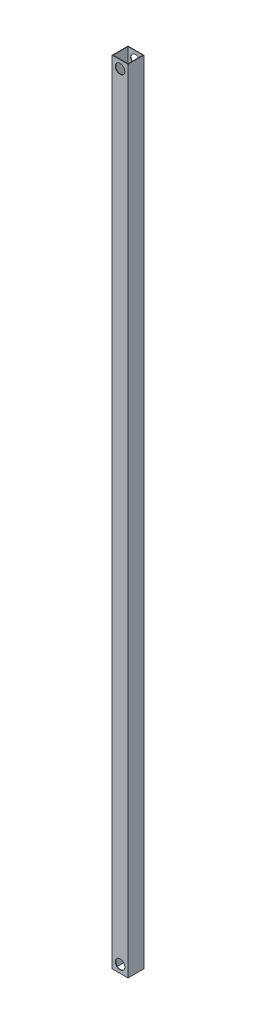
ISO-10303-21;
HEADER;
FILE_DESCRIPTION(('STEP AP214'),'2;1');
FILE_NAME('part.step','',(''),(''),'','','');
FILE_SCHEMA(('AUTOMOTIVE_DESIGN { 1 0 10303 214 1 1 1 1 }'));
ENDSEC;
DATA;
#1=APPLICATION_CONTEXT('core data for automotive mechanical design processes');
#2=APPLICATION_PROTOCOL_DEFINITION('international standard','automotive_design',2000,#1);
#3=PRODUCT_CONTEXT('',#1,'mechanical');
#4=PRODUCT('Part','Part','',(#3));
#5=PRODUCT_RELATED_PRODUCT_CATEGORY('part','',(#4));
#6=PRODUCT_DEFINITION_FORMATION('','',#4);
#7=PRODUCT_DEFINITION_CONTEXT('part definition',#1,'design');
#8=PRODUCT_DEFINITION('design','',#6,#7);
#9=PRODUCT_DEFINITION_SHAPE('','',#8);
#10=(LENGTH_UNIT() NAMED_UNIT(*) SI_UNIT(.MILLI.,.METRE.));
#11=(NAMED_UNIT(*) PLANE_ANGLE_UNIT() SI_UNIT($,.RADIAN.));
#12=(NAMED_UNIT(*) SI_UNIT($,.STERADIAN.) SOLID_ANGLE_UNIT());
#13=UNCERTAINTY_MEASURE_WITH_UNIT(LENGTH_MEASURE(1.E-05),#10,'distance_accuracy_value','');
#14=(GEOMETRIC_REPRESENTATION_CONTEXT(3) GLOBAL_UNCERTAINTY_ASSIGNED_CONTEXT((#13)) GLOBAL_UNIT_ASSIGNED_CONTEXT((#10,
#11,#12)) REPRESENTATION_CONTEXT('',''));
#15=CARTESIAN_POINT('',(0.,0.,0.));
#16=DIRECTION('',(0.,0.,1.));
#17=DIRECTION('',(1.,0.,0.));
#18=AXIS2_PLACEMENT_3D('',#15,#16,#17);
#19=CARTESIAN_POINT('',(5.,500.,-5.));
#20=DIRECTION('',(-1.,0.,0.));
#21=DIRECTION('',(0.,0.,1.));
#22=AXIS2_PLACEMENT_3D('',#19,#20,#21);
#23=PLANE('',#22);
#24=DIRECTION('',(0.,0.,-1.));
#25=VECTOR('',#24,1.);
#26=CARTESIAN_POINT('',(5.,0.,-5.));
#27=LINE('',#26,#25);
#28=CARTESIAN_POINT('',(5.,0.,5.));
#29=VERTEX_POINT('',#28);
#30=CARTESIAN_POINT('',(5.,0.,-5.));
#31=VERTEX_POINT('',#30);
#32=EDGE_CURVE('E152',#29,#31,#27,.T.);
#33=ORIENTED_EDGE('',*,*,#32,.T.);
#34=DIRECTION('',(0.,-1.,0.));
#35=VECTOR('',#34,1.);
#36=CARTESIAN_POINT('',(5.,500.,-5.));
#37=LINE('',#36,#35);
#38=CARTESIAN_POINT('',(5.,500.,-5.));
#39=VERTEX_POINT('',#38);
#40=EDGE_CURVE('E11',#39,#31,#37,.T.);
#41=ORIENTED_EDGE('',*,*,#40,.F.);
#42=DIRECTION('',(0.,0.,-1.));
#43=VECTOR('',#42,1.);
#44=CARTESIAN_POINT('',(5.,500.,-5.));
#45=LINE('',#44,#43);
#46=CARTESIAN_POINT('',(5.,500.,5.));
#47=VERTEX_POINT('',#46);
#48=EDGE_CURVE('E158',#47,#39,#45,.T.);
#49=ORIENTED_EDGE('',*,*,#48,.F.);
#50=DIRECTION('',(0.,-1.,0.));
#51=VECTOR('',#50,1.);
#52=CARTESIAN_POINT('',(5.,500.,5.));
#53=LINE('',#52,#51);
#54=EDGE_CURVE('E172',#47,#29,#53,.T.);
#55=ORIENTED_EDGE('',*,*,#54,.T.);
#56=EDGE_LOOP('',(#33,#41,#49,#55));
#57=FACE_BOUND('',#56,.T.);
#58=ADVANCED_FACE('F39',(#57),#23,.F.);
#59=CARTESIAN_POINT('',(-5.,500.,-5.));
#60=DIRECTION('',(0.,0.,1.));
#61=DIRECTION('',(1.,0.,0.));
#62=AXIS2_PLACEMENT_3D('',#59,#60,#61);
#63=PLANE('',#62);
#64=CARTESIAN_POINT('',(0.,495.,-5.));
#65=DIRECTION('',(0.,0.,1.));
#66=DIRECTION('',(1.,0.,0.));
#67=AXIS2_PLACEMENT_3D('',#64,#65,#66);
#68=CIRCLE('',#67,3.);
#69=CARTESIAN_POINT('',(2.99999999999998,495.,-5.));
#70=VERTEX_POINT('',#69);
#71=EDGE_CURVE('E204',#70,#70,#68,.T.);
#72=ORIENTED_EDGE('',*,*,#71,.T.);
#73=EDGE_LOOP('',(#72));
#74=FACE_BOUND('',#73,.T.);
#75=CARTESIAN_POINT('',(0.,5.,-5.));
#76=DIRECTION('',(0.,0.,1.));
#77=DIRECTION('',(1.,0.,0.));
#78=AXIS2_PLACEMENT_3D('',#75,#76,#77);
#79=CIRCLE('',#78,3.);
#80=CARTESIAN_POINT('',(3.,5.,-5.));
#81=VERTEX_POINT('',#80);
#82=EDGE_CURVE('E134',#81,#81,#79,.T.);
#83=ORIENTED_EDGE('',*,*,#82,.T.);
#84=EDGE_LOOP('',(#83));
#85=FACE_BOUND('',#84,.T.);
#86=DIRECTION('',(-1.,0.,0.));
#87=VECTOR('',#86,1.);
#88=CARTESIAN_POINT('',(-5.,0.,-5.));
#89=LINE('',#88,#87);
#90=CARTESIAN_POINT('',(-5.,0.,-5.));
#91=VERTEX_POINT('',#90);
#92=EDGE_CURVE('E176',#31,#91,#89,.T.);
#93=ORIENTED_EDGE('',*,*,#92,.T.);
#94=DIRECTION('',(0.,-1.,0.));
#95=VECTOR('',#94,1.);
#96=CARTESIAN_POINT('',(-5.,500.,-5.));
#97=LINE('',#96,#95);
#98=CARTESIAN_POINT('',(-5.,500.,-5.));
#99=VERTEX_POINT('',#98);
#100=EDGE_CURVE('E48',#99,#91,#97,.T.);
#101=ORIENTED_EDGE('',*,*,#100,.F.);
#102=DIRECTION('',(-1.,0.,0.));
#103=VECTOR('',#102,1.);
#104=CARTESIAN_POINT('',(-5.,500.,-5.));
#105=LINE('',#104,#103);
#106=EDGE_CURVE('E162',#39,#99,#105,.T.);
#107=ORIENTED_EDGE('',*,*,#106,.F.);
#108=ORIENTED_EDGE('',*,*,#40,.T.);
#109=EDGE_LOOP('',(#93,#101,#107,#108));
#110=FACE_BOUND('',#109,.T.);
#111=ADVANCED_FACE('F234',(#74,#85,#110),#63,.F.);
#112=CARTESIAN_POINT('',(-5.,500.,-5.));
#113=DIRECTION('',(1.,0.,0.));
#114=DIRECTION('',(0.,0.,-1.));
#115=AXIS2_PLACEMENT_3D('',#112,#113,#114);
#116=PLANE('',#115);
#117=DIRECTION('',(0.,0.,1.));
#118=VECTOR('',#117,1.);
#119=CARTESIAN_POINT('',(-5.,0.,-5.));
#120=LINE('',#119,#118);
#121=CARTESIAN_POINT('',(-5.,0.,5.));
#122=VERTEX_POINT('',#121);
#123=EDGE_CURVE('E179',#91,#122,#120,.T.);
#124=ORIENTED_EDGE('',*,*,#123,.T.);
#125=DIRECTION('',(0.,-1.,0.));
#126=VECTOR('',#125,1.);
#127=CARTESIAN_POINT('',(-5.,500.,5.));
#128=LINE('',#127,#126);
#129=CARTESIAN_POINT('',(-5.,500.,5.));
#130=VERTEX_POINT('',#129);
#131=EDGE_CURVE('E187',#130,#122,#128,.T.);
#132=ORIENTED_EDGE('',*,*,#131,.F.);
#133=DIRECTION('',(0.,0.,1.));
#134=VECTOR('',#133,1.);
#135=CARTESIAN_POINT('',(-5.,500.,-5.));
#136=LINE('',#135,#134);
#137=EDGE_CURVE('E166',#99,#130,#136,.T.);
#138=ORIENTED_EDGE('',*,*,#137,.F.);
#139=ORIENTED_EDGE('',*,*,#100,.T.);
#140=EDGE_LOOP('',(#124,#132,#138,#139));
#141=FACE_BOUND('',#140,.T.);
#142=ADVANCED_FACE('F237',(#141),#116,.F.);
#143=CARTESIAN_POINT('',(-5.,500.,5.));
#144=DIRECTION('',(0.,0.,-1.));
#145=DIRECTION('',(-1.,0.,0.));
#146=AXIS2_PLACEMENT_3D('',#143,#144,#145);
#147=PLANE('',#146);
#148=CARTESIAN_POINT('',(0.,495.,5.));
#149=DIRECTION('',(0.,0.,1.));
#150=DIRECTION('',(1.,0.,0.));
#151=AXIS2_PLACEMENT_3D('',#148,#149,#150);
#152=CIRCLE('',#151,3.);
#153=CARTESIAN_POINT('',(2.99999999999998,495.,5.));
#154=VERTEX_POINT('',#153);
#155=EDGE_CURVE('E216',#154,#154,#152,.T.);
#156=ORIENTED_EDGE('',*,*,#155,.F.);
#157=EDGE_LOOP('',(#156));
#158=FACE_BOUND('',#157,.T.);
#159=CARTESIAN_POINT('',(0.,5.,5.));
#160=DIRECTION('',(0.,0.,1.));
#161=DIRECTION('',(1.,0.,0.));
#162=AXIS2_PLACEMENT_3D('',#159,#160,#161);
#163=CIRCLE('',#162,3.);
#164=CARTESIAN_POINT('',(3.,5.,5.));
#165=VERTEX_POINT('',#164);
#166=EDGE_CURVE('E197',#165,#165,#163,.T.);
#167=ORIENTED_EDGE('',*,*,#166,.F.);
#168=EDGE_LOOP('',(#167));
#169=FACE_BOUND('',#168,.T.);
#170=DIRECTION('',(1.,0.,0.));
#171=VECTOR('',#170,1.);
#172=CARTESIAN_POINT('',(-5.,0.,5.));
#173=LINE('',#172,#171);
#174=EDGE_CURVE('E163',#122,#29,#173,.T.);
#175=ORIENTED_EDGE('',*,*,#174,.T.);
#176=ORIENTED_EDGE('',*,*,#54,.F.);
#177=DIRECTION('',(1.,0.,0.));
#178=VECTOR('',#177,1.);
#179=CARTESIAN_POINT('',(-5.,500.,5.));
#180=LINE('',#179,#178);
#181=EDGE_CURVE('E169',#130,#47,#180,.T.);
#182=ORIENTED_EDGE('',*,*,#181,.F.);
#183=ORIENTED_EDGE('',*,*,#131,.T.);
#184=EDGE_LOOP('',(#175,#176,#182,#183));
#185=FACE_BOUND('',#184,.T.);
#186=ADVANCED_FACE('F251',(#158,#169,#185),#147,.F.);
#187=CARTESIAN_POINT('',(0.,500.,0.));
#188=DIRECTION('',(0.,1.,0.));
#189=DIRECTION('',(0.,0.,1.));
#190=AXIS2_PLACEMENT_3D('',#187,#188,#189);
#191=PLANE('',#190);
#192=DIRECTION('',(0.,0.,-1.));
#193=VECTOR('',#192,1.);
#194=CARTESIAN_POINT('',(4.683,500.,-4.683));
#195=LINE('',#194,#193);
#196=CARTESIAN_POINT('',(4.683,500.,4.683));
#197=VERTEX_POINT('',#196);
#198=CARTESIAN_POINT('',(4.683,500.,-4.683));
#199=VERTEX_POINT('',#198);
#200=EDGE_CURVE('E56',#197,#199,#195,.T.);
#201=ORIENTED_EDGE('',*,*,#200,.F.);
#202=DIRECTION('',(1.,0.,0.));
#203=VECTOR('',#202,1.);
#204=CARTESIAN_POINT('',(-4.683,500.,4.683));
#205=LINE('',#204,#203);
#206=CARTESIAN_POINT('',(-4.683,500.,4.683));
#207=VERTEX_POINT('',#206);
#208=EDGE_CURVE('E127',#207,#197,#205,.T.);
#209=ORIENTED_EDGE('',*,*,#208,.F.);
#210=DIRECTION('',(0.,0.,1.));
#211=VECTOR('',#210,1.);
#212=CARTESIAN_POINT('',(-4.683,500.,-4.683));
#213=LINE('',#212,#211);
#214=CARTESIAN_POINT('',(-4.683,500.,-4.683));
#215=VERTEX_POINT('',#214);
#216=EDGE_CURVE('E131',#215,#207,#213,.T.);
#217=ORIENTED_EDGE('',*,*,#216,.F.);
#218=DIRECTION('',(-1.,0.,0.));
#219=VECTOR('',#218,1.);
#220=CARTESIAN_POINT('',(-4.683,500.,-4.683));
#221=LINE('',#220,#219);
#222=EDGE_CURVE('E143',#199,#215,#221,.T.);
#223=ORIENTED_EDGE('',*,*,#222,.F.);
#224=EDGE_LOOP('',(#201,#209,#217,#223));
#225=FACE_BOUND('',#224,.T.);
#226=ORIENTED_EDGE('',*,*,#48,.T.);
#227=ORIENTED_EDGE('',*,*,#106,.T.);
#228=ORIENTED_EDGE('',*,*,#137,.T.);
#229=ORIENTED_EDGE('',*,*,#181,.T.);
#230=EDGE_LOOP('',(#226,#227,#228,#229));
#231=FACE_BOUND('',#230,.T.);
#232=ADVANCED_FACE('F256',(#225,#231),#191,.T.);
#233=CARTESIAN_POINT('',(0.,0.,0.));
#234=DIRECTION('',(0.,1.,0.));
#235=DIRECTION('',(0.,0.,1.));
#236=AXIS2_PLACEMENT_3D('',#233,#234,#235);
#237=PLANE('',#236);
#238=DIRECTION('',(1.,0.,0.));
#239=VECTOR('',#238,1.);
#240=CARTESIAN_POINT('',(-4.683,0.,4.683));
#241=LINE('',#240,#239);
#242=CARTESIAN_POINT('',(-4.683,0.,4.683));
#243=VERTEX_POINT('',#242);
#244=CARTESIAN_POINT('',(4.683,0.,4.683));
#245=VERTEX_POINT('',#244);
#246=EDGE_CURVE('E115',#243,#245,#241,.T.);
#247=ORIENTED_EDGE('',*,*,#246,.T.);
#248=DIRECTION('',(0.,0.,-1.));
#249=VECTOR('',#248,1.);
#250=CARTESIAN_POINT('',(4.683,0.,-4.683));
#251=LINE('',#250,#249);
#252=CARTESIAN_POINT('',(4.683,0.,-4.683));
#253=VERTEX_POINT('',#252);
#254=EDGE_CURVE('E108',#245,#253,#251,.T.);
#255=ORIENTED_EDGE('',*,*,#254,.T.);
#256=DIRECTION('',(-1.,0.,0.));
#257=VECTOR('',#256,1.);
#258=CARTESIAN_POINT('',(-4.683,0.,-4.683));
#259=LINE('',#258,#257);
#260=CARTESIAN_POINT('',(-4.683,0.,-4.683));
#261=VERTEX_POINT('',#260);
#262=EDGE_CURVE('E118',#253,#261,#259,.T.);
#263=ORIENTED_EDGE('',*,*,#262,.T.);
#264=DIRECTION('',(0.,0.,1.));
#265=VECTOR('',#264,1.);
#266=CARTESIAN_POINT('',(-4.683,0.,-4.683));
#267=LINE('',#266,#265);
#268=EDGE_CURVE('E64',#261,#243,#267,.T.);
#269=ORIENTED_EDGE('',*,*,#268,.T.);
#270=EDGE_LOOP('',(#247,#255,#263,#269));
#271=FACE_BOUND('',#270,.T.);
#272=ORIENTED_EDGE('',*,*,#32,.F.);
#273=ORIENTED_EDGE('',*,*,#174,.F.);
#274=ORIENTED_EDGE('',*,*,#123,.F.);
#275=ORIENTED_EDGE('',*,*,#92,.F.);
#276=EDGE_LOOP('',(#272,#273,#274,#275));
#277=FACE_BOUND('',#276,.T.);
#278=ADVANCED_FACE('F123',(#271,#277),#237,.F.);
#279=CARTESIAN_POINT('',(4.683,0.,-4.683));
#280=DIRECTION('',(1.,0.,0.));
#281=DIRECTION('',(0.,0.,-1.));
#282=AXIS2_PLACEMENT_3D('',#279,#280,#281);
#283=PLANE('',#282);
#284=ORIENTED_EDGE('',*,*,#200,.T.);
#285=DIRECTION('',(0.,1.,0.));
#286=VECTOR('',#285,1.);
#287=CARTESIAN_POINT('',(4.683,0.,-4.683));
#288=LINE('',#287,#286);
#289=EDGE_CURVE('E104',#253,#199,#288,.T.);
#290=ORIENTED_EDGE('',*,*,#289,.F.);
#291=ORIENTED_EDGE('',*,*,#254,.F.);
#292=DIRECTION('',(0.,1.,0.));
#293=VECTOR('',#292,1.);
#294=CARTESIAN_POINT('',(4.683,0.,4.683));
#295=LINE('',#294,#293);
#296=EDGE_CURVE('E149',#245,#197,#295,.T.);
#297=ORIENTED_EDGE('',*,*,#296,.T.);
#298=EDGE_LOOP('',(#284,#290,#291,#297));
#299=FACE_BOUND('',#298,.T.);
#300=ADVANCED_FACE('F106',(#299),#283,.F.);
#301=CARTESIAN_POINT('',(-4.683,0.,4.683));
#302=DIRECTION('',(0.,0.,1.));
#303=DIRECTION('',(1.,0.,0.));
#304=AXIS2_PLACEMENT_3D('',#301,#302,#303);
#305=PLANE('',#304);
#306=CARTESIAN_POINT('',(0.,495.,4.68299999999999));
#307=DIRECTION('',(0.,0.,1.));
#308=DIRECTION('',(1.,0.,0.));
#309=AXIS2_PLACEMENT_3D('',#306,#307,#308);
#310=CIRCLE('',#309,3.);
#311=CARTESIAN_POINT('',(2.99999999999998,495.,4.68299999999999));
#312=VERTEX_POINT('',#311);
#313=EDGE_CURVE('E210',#312,#312,#310,.T.);
#314=ORIENTED_EDGE('',*,*,#313,.T.);
#315=EDGE_LOOP('',(#314));
#316=FACE_BOUND('',#315,.T.);
#317=CARTESIAN_POINT('',(0.,5.,4.68299999999999));
#318=DIRECTION('',(0.,0.,1.));
#319=DIRECTION('',(1.,0.,0.));
#320=AXIS2_PLACEMENT_3D('',#317,#318,#319);
#321=CIRCLE('',#320,3.);
#322=CARTESIAN_POINT('',(3.,5.,4.68299999999999));
#323=VERTEX_POINT('',#322);
#324=EDGE_CURVE('E196',#323,#323,#321,.T.);
#325=ORIENTED_EDGE('',*,*,#324,.T.);
#326=EDGE_LOOP('',(#325));
#327=FACE_BOUND('',#326,.T.);
#328=ORIENTED_EDGE('',*,*,#208,.T.);
#329=ORIENTED_EDGE('',*,*,#296,.F.);
#330=ORIENTED_EDGE('',*,*,#246,.F.);
#331=DIRECTION('',(0.,1.,0.));
#332=VECTOR('',#331,1.);
#333=CARTESIAN_POINT('',(-4.683,0.,4.683));
#334=LINE('',#333,#332);
#335=EDGE_CURVE('E153',#243,#207,#334,.T.);
#336=ORIENTED_EDGE('',*,*,#335,.T.);
#337=EDGE_LOOP('',(#328,#329,#330,#336));
#338=FACE_BOUND('',#337,.T.);
#339=ADVANCED_FACE('F292',(#316,#327,#338),#305,.F.);
#340=CARTESIAN_POINT('',(-4.683,0.,-4.683));
#341=DIRECTION('',(-1.,0.,0.));
#342=DIRECTION('',(0.,0.,1.));
#343=AXIS2_PLACEMENT_3D('',#340,#341,#342);
#344=PLANE('',#343);
#345=ORIENTED_EDGE('',*,*,#216,.T.);
#346=ORIENTED_EDGE('',*,*,#335,.F.);
#347=ORIENTED_EDGE('',*,*,#268,.F.);
#348=DIRECTION('',(0.,1.,0.));
#349=VECTOR('',#348,1.);
#350=CARTESIAN_POINT('',(-4.683,0.,-4.683));
#351=LINE('',#350,#349);
#352=EDGE_CURVE('E114',#261,#215,#351,.T.);
#353=ORIENTED_EDGE('',*,*,#352,.T.);
#354=EDGE_LOOP('',(#345,#346,#347,#353));
#355=FACE_BOUND('',#354,.T.);
#356=ADVANCED_FACE('F297',(#355),#344,.F.);
#357=CARTESIAN_POINT('',(-4.683,0.,-4.683));
#358=DIRECTION('',(0.,0.,-1.));
#359=DIRECTION('',(-1.,0.,0.));
#360=AXIS2_PLACEMENT_3D('',#357,#358,#359);
#361=PLANE('',#360);
#362=CARTESIAN_POINT('',(0.,495.,-4.68299999999999));
#363=DIRECTION('',(0.,0.,-1.));
#364=DIRECTION('',(-1.,0.,0.));
#365=AXIS2_PLACEMENT_3D('',#362,#363,#364);
#366=CIRCLE('',#365,3.);
#367=CARTESIAN_POINT('',(-3.00000000000003,495.,-4.68299999999999));
#368=VERTEX_POINT('',#367);
#369=EDGE_CURVE('E42',#368,#368,#366,.T.);
#370=ORIENTED_EDGE('',*,*,#369,.T.);
#371=EDGE_LOOP('',(#370));
#372=FACE_BOUND('',#371,.T.);
#373=CARTESIAN_POINT('',(0.,5.,-4.68299999999999));
#374=DIRECTION('',(0.,0.,-1.));
#375=DIRECTION('',(-1.,0.,0.));
#376=AXIS2_PLACEMENT_3D('',#373,#374,#375);
#377=CIRCLE('',#376,3.);
#378=CARTESIAN_POINT('',(-3.,5.,-4.68299999999999));
#379=VERTEX_POINT('',#378);
#380=EDGE_CURVE('E193',#379,#379,#377,.T.);
#381=ORIENTED_EDGE('',*,*,#380,.T.);
#382=EDGE_LOOP('',(#381));
#383=FACE_BOUND('',#382,.T.);
#384=ORIENTED_EDGE('',*,*,#222,.T.);
#385=ORIENTED_EDGE('',*,*,#352,.F.);
#386=ORIENTED_EDGE('',*,*,#262,.F.);
#387=ORIENTED_EDGE('',*,*,#289,.T.);
#388=EDGE_LOOP('',(#384,#385,#386,#387));
#389=FACE_BOUND('',#388,.T.);
#390=ADVANCED_FACE('F119',(#372,#383,#389),#361,.F.);
#391=CARTESIAN_POINT('',(0.,5.,-495.));
#392=DIRECTION('',(0.,0.,1.));
#393=DIRECTION('',(1.,0.,0.));
#394=AXIS2_PLACEMENT_3D('',#391,#392,#393);
#395=CYLINDRICAL_SURFACE('',#394,3.);
#396=ORIENTED_EDGE('',*,*,#380,.F.);
#397=EDGE_LOOP('',(#396));
#398=FACE_BOUND('',#397,.T.);
#399=ORIENTED_EDGE('',*,*,#82,.F.);
#400=EDGE_LOOP('',(#399));
#401=FACE_BOUND('',#400,.T.);
#402=ADVANCED_FACE('F311',(#398,#401),#395,.F.);
#403=ORIENTED_EDGE('',*,*,#166,.T.);
#404=EDGE_LOOP('',(#403));
#405=FACE_BOUND('',#404,.T.);
#406=ORIENTED_EDGE('',*,*,#324,.F.);
#407=EDGE_LOOP('',(#406));
#408=FACE_BOUND('',#407,.T.);
#409=ADVANCED_FACE('F230',(#405,#408),#395,.F.);
#410=CARTESIAN_POINT('',(0.,495.,-495.));
#411=DIRECTION('',(0.,0.,1.));
#412=DIRECTION('',(1.,0.,0.));
#413=AXIS2_PLACEMENT_3D('',#410,#411,#412);
#414=CYLINDRICAL_SURFACE('',#413,3.);
#415=ORIENTED_EDGE('',*,*,#369,.F.);
#416=EDGE_LOOP('',(#415));
#417=FACE_BOUND('',#416,.T.);
#418=ORIENTED_EDGE('',*,*,#71,.F.);
#419=EDGE_LOOP('',(#418));
#420=FACE_BOUND('',#419,.T.);
#421=ADVANCED_FACE('F226',(#417,#420),#414,.F.);
#422=ORIENTED_EDGE('',*,*,#155,.T.);
#423=EDGE_LOOP('',(#422));
#424=FACE_BOUND('',#423,.T.);
#425=ORIENTED_EDGE('',*,*,#313,.F.);
#426=EDGE_LOOP('',(#425));
#427=FACE_BOUND('',#426,.T.);
#428=ADVANCED_FACE('F229',(#424,#427),#414,.F.);
#429=CLOSED_SHELL('',(#58,#111,#142,#186,#232,#278,#300,#339,#356,#390,#402,#409,#421,#428));
#430=MANIFOLD_SOLID_BREP('B2',#429);
#431=ADVANCED_BREP_SHAPE_REPRESENTATION('',(#18,#430),#14);
#432=SHAPE_DEFINITION_REPRESENTATION(#9,#431);
ENDSEC;
END-ISO-10303-21;
